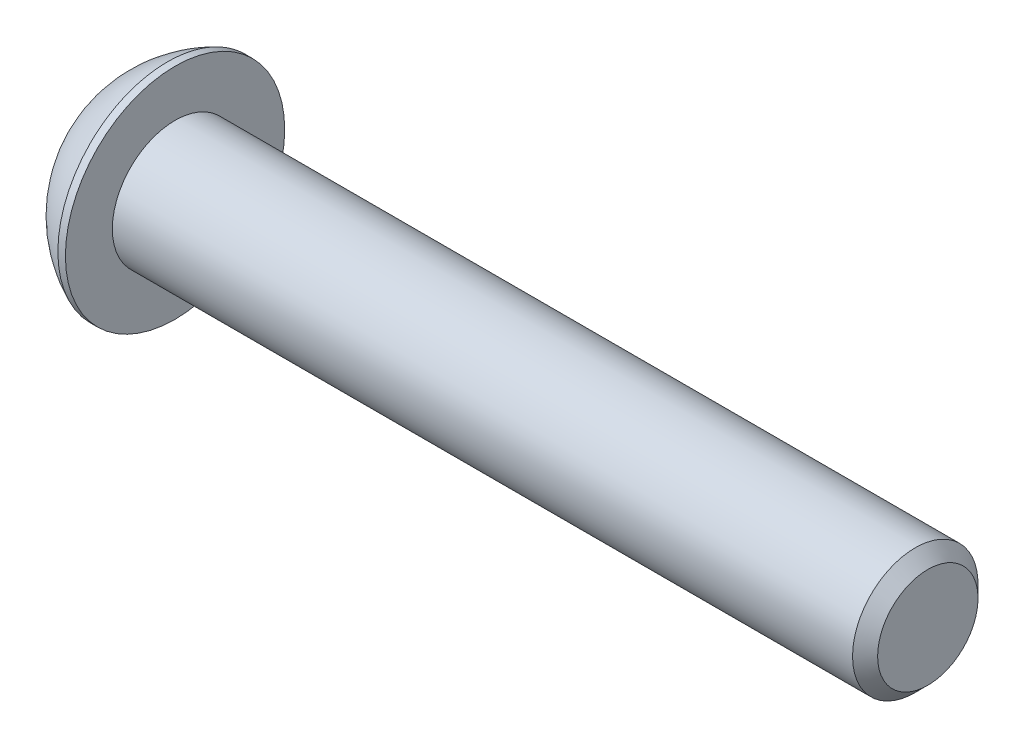
ISO-10303-21;
HEADER;
FILE_DESCRIPTION(('STEP AP214'),'2;1');
FILE_NAME('part.step','',(''),(''),'','','');
FILE_SCHEMA(('AUTOMOTIVE_DESIGN { 1 0 10303 214 1 1 1 1 }'));
ENDSEC;
DATA;
#1=APPLICATION_CONTEXT('core data for automotive mechanical design processes');
#2=APPLICATION_PROTOCOL_DEFINITION('international standard','automotive_design',2000,#1);
#3=PRODUCT_CONTEXT('',#1,'mechanical');
#4=PRODUCT('Part','Part','',(#3));
#5=PRODUCT_RELATED_PRODUCT_CATEGORY('part','',(#4));
#6=PRODUCT_DEFINITION_FORMATION('','',#4);
#7=PRODUCT_DEFINITION_CONTEXT('part definition',#1,'design');
#8=PRODUCT_DEFINITION('design','',#6,#7);
#9=PRODUCT_DEFINITION_SHAPE('','',#8);
#10=(LENGTH_UNIT() NAMED_UNIT(*) SI_UNIT(.MILLI.,.METRE.));
#11=(NAMED_UNIT(*) PLANE_ANGLE_UNIT() SI_UNIT($,.RADIAN.));
#12=(NAMED_UNIT(*) SI_UNIT($,.STERADIAN.) SOLID_ANGLE_UNIT());
#13=UNCERTAINTY_MEASURE_WITH_UNIT(LENGTH_MEASURE(1.E-05),#10,'distance_accuracy_value','');
#14=(GEOMETRIC_REPRESENTATION_CONTEXT(3) GLOBAL_UNCERTAINTY_ASSIGNED_CONTEXT((#13)) GLOBAL_UNIT_ASSIGNED_CONTEXT((#10,
#11,#12)) REPRESENTATION_CONTEXT('',''));
#15=CARTESIAN_POINT('',(0.,0.,0.));
#16=DIRECTION('',(0.,0.,1.));
#17=DIRECTION('',(1.,0.,0.));
#18=AXIS2_PLACEMENT_3D('',#15,#16,#17);
#19=CARTESIAN_POINT('',(1.32080000000034,0.,0.));
#20=DIRECTION('',(-1.,0.,0.));
#21=DIRECTION('',(0.,0.,1.));
#22=AXIS2_PLACEMENT_3D('',#19,#20,#21);
#23=CONICAL_SURFACE('',#22,1.1937999999998,1.04719755119608);
#24=CARTESIAN_POINT('',(2.01004075135902,0.,-4.44089209850063E-13));
#25=VERTEX_POINT('',#24);
#26=VERTEX_LOOP('',#25);
#27=FACE_BOUND('',#26,.T.);
#28=CARTESIAN_POINT('',(1.32080000000009,0.,0.));
#29=DIRECTION('',(-1.,0.,0.));
#30=DIRECTION('',(0.,0.,1.));
#31=AXIS2_PLACEMENT_3D('',#28,#29,#30);
#32=CIRCLE('',#31,1.19380000000024);
#33=CARTESIAN_POINT('',(1.32080000000009,0.,1.19380000000024));
#34=VERTEX_POINT('',#33);
#35=EDGE_CURVE('E20',#34,#34,#32,.T.);
#36=ORIENTED_EDGE('',*,*,#35,.T.);
#37=EDGE_LOOP('',(#36));
#38=FACE_BOUND('',#37,.T.);
#39=ADVANCED_FACE('F17',(#27,#38),#23,.F.);
#40=CARTESIAN_POINT('',(1.3208,-2.28769270663697,0.));
#41=DIRECTION('',(1.,0.,0.));
#42=DIRECTION('',(0.,0.,-1.));
#43=AXIS2_PLACEMENT_3D('',#40,#41,#42);
#44=PLANE('',#43);
#45=DIRECTION('',(0.,1.,0.));
#46=VECTOR('',#45,1.);
#47=CARTESIAN_POINT('',(1.3208,-1.14384635331849,1.9812));
#48=LINE('',#47,#46);
#49=CARTESIAN_POINT('',(1.3208,1.14384635331849,1.9812));
#50=VERTEX_POINT('',#49);
#51=CARTESIAN_POINT('',(1.3208,-1.14384635331849,1.9812));
#52=VERTEX_POINT('',#51);
#53=EDGE_CURVE('E69',#50,#52,#48,.F.);
#54=ORIENTED_EDGE('',*,*,#53,.F.);
#55=DIRECTION('',(0.,0.5,-0.866025403784439));
#56=VECTOR('',#55,1.);
#57=CARTESIAN_POINT('',(1.3208,1.14384635331849,1.9812));
#58=LINE('',#57,#56);
#59=CARTESIAN_POINT('',(1.3208,2.28769270663697,0.));
#60=VERTEX_POINT('',#59);
#61=EDGE_CURVE('E287',#60,#50,#58,.F.);
#62=ORIENTED_EDGE('',*,*,#61,.F.);
#63=DIRECTION('',(0.,-0.5,-0.866025403784439));
#64=VECTOR('',#63,1.);
#65=CARTESIAN_POINT('',(1.3208,2.28769270663697,0.));
#66=LINE('',#65,#64);
#67=CARTESIAN_POINT('',(1.3208,1.14384635331849,-1.9812));
#68=VERTEX_POINT('',#67);
#69=EDGE_CURVE('E291',#68,#60,#66,.F.);
#70=ORIENTED_EDGE('',*,*,#69,.F.);
#71=DIRECTION('',(0.,1.,0.));
#72=VECTOR('',#71,1.);
#73=CARTESIAN_POINT('',(1.3208,1.14384635331849,-1.9812));
#74=LINE('',#73,#72);
#75=CARTESIAN_POINT('',(1.3208,-1.14384635331849,-1.9812));
#76=VERTEX_POINT('',#75);
#77=EDGE_CURVE('E296',#76,#68,#74,.T.);
#78=ORIENTED_EDGE('',*,*,#77,.F.);
#79=DIRECTION('',(0.,-0.5,0.866025403784438));
#80=VECTOR('',#79,1.);
#81=CARTESIAN_POINT('',(1.3208,-1.14384635331849,-1.9812));
#82=LINE('',#81,#80);
#83=CARTESIAN_POINT('',(1.3208,-2.28769270663697,0.));
#84=VERTEX_POINT('',#83);
#85=EDGE_CURVE('E301',#84,#76,#82,.F.);
#86=ORIENTED_EDGE('',*,*,#85,.F.);
#87=DIRECTION('',(0.,0.500000000000001,0.866025403784438));
#88=VECTOR('',#87,1.);
#89=CARTESIAN_POINT('',(1.3208,-2.28769270663697,0.));
#90=LINE('',#89,#88);
#91=EDGE_CURVE('E82',#52,#84,#90,.F.);
#92=ORIENTED_EDGE('',*,*,#91,.F.);
#93=EDGE_LOOP('',(#54,#62,#70,#78,#86,#92));
#94=FACE_BOUND('',#93,.T.);
#95=ORIENTED_EDGE('',*,*,#35,.F.);
#96=EDGE_LOOP('',(#95));
#97=FACE_BOUND('',#96,.T.);
#98=ADVANCED_FACE('F75',(#94,#97),#44,.F.);
#99=CARTESIAN_POINT('',(1.3208,-1.14384635331849,1.9812));
#100=DIRECTION('',(0.,0.,-1.));
#101=DIRECTION('',(-1.,0.,0.));
#102=AXIS2_PLACEMENT_3D('',#99,#100,#101);
#103=PLANE('',#102);
#104=ORIENTED_EDGE('',*,*,#53,.T.);
#105=DIRECTION('',(1.,0.,0.));
#106=VECTOR('',#105,1.);
#107=CARTESIAN_POINT('',(1.3208,-1.14384635331849,1.9812));
#108=LINE('',#107,#106);
#109=CARTESIAN_POINT('',(0.,-1.14384635331849,1.9812));
#110=VERTEX_POINT('',#109);
#111=EDGE_CURVE('E79',#110,#52,#108,.T.);
#112=ORIENTED_EDGE('',*,*,#111,.F.);
#113=DIRECTION('',(0.,1.,0.));
#114=VECTOR('',#113,1.);
#115=CARTESIAN_POINT('',(0.,0.,1.9812));
#116=LINE('',#115,#114);
#117=CARTESIAN_POINT('',(0.,1.14384635331849,1.9812));
#118=VERTEX_POINT('',#117);
#119=EDGE_CURVE('E281',#118,#110,#116,.F.);
#120=ORIENTED_EDGE('',*,*,#119,.F.);
#121=DIRECTION('',(1.,0.,0.));
#122=VECTOR('',#121,1.);
#123=CARTESIAN_POINT('',(1.3208,1.14384635331849,1.9812));
#124=LINE('',#123,#122);
#125=EDGE_CURVE('E284',#50,#118,#124,.F.);
#126=ORIENTED_EDGE('',*,*,#125,.F.);
#127=EDGE_LOOP('',(#104,#112,#120,#126));
#128=FACE_BOUND('',#127,.T.);
#129=ADVANCED_FACE('F128',(#128),#103,.T.);
#130=CARTESIAN_POINT('',(1.3208,-2.28769270663697,0.));
#131=DIRECTION('',(0.,0.866025403784438,-0.500000000000001));
#132=DIRECTION('',(0.,0.500000000000001,0.866025403784438));
#133=AXIS2_PLACEMENT_3D('',#130,#131,#132);
#134=PLANE('',#133);
#135=ORIENTED_EDGE('',*,*,#91,.T.);
#136=DIRECTION('',(1.,0.,0.));
#137=VECTOR('',#136,1.);
#138=CARTESIAN_POINT('',(1.3208,-2.28769270663697,0.));
#139=LINE('',#138,#137);
#140=CARTESIAN_POINT('',(0.,-2.28769270663697,0.));
#141=VERTEX_POINT('',#140);
#142=EDGE_CURVE('E303',#141,#84,#139,.T.);
#143=ORIENTED_EDGE('',*,*,#142,.F.);
#144=DIRECTION('',(0.,-0.500000000000001,-0.866025403784438));
#145=VECTOR('',#144,1.);
#146=CARTESIAN_POINT('',(0.,-1.14384635331849,1.9812));
#147=LINE('',#146,#145);
#148=EDGE_CURVE('E278',#110,#141,#147,.T.);
#149=ORIENTED_EDGE('',*,*,#148,.F.);
#150=ORIENTED_EDGE('',*,*,#111,.T.);
#151=EDGE_LOOP('',(#135,#143,#149,#150));
#152=FACE_BOUND('',#151,.T.);
#153=ADVANCED_FACE('F124',(#152),#134,.T.);
#154=CARTESIAN_POINT('',(1.3208,-1.14384635331849,-1.9812));
#155=DIRECTION('',(0.,0.866025403784438,0.5));
#156=DIRECTION('',(0.,-0.5,0.866025403784438));
#157=AXIS2_PLACEMENT_3D('',#154,#155,#156);
#158=PLANE('',#157);
#159=ORIENTED_EDGE('',*,*,#85,.T.);
#160=DIRECTION('',(1.,0.,0.));
#161=VECTOR('',#160,1.);
#162=CARTESIAN_POINT('',(1.3208,-1.14384635331849,-1.9812));
#163=LINE('',#162,#161);
#164=CARTESIAN_POINT('',(0.,-1.14384635331849,-1.9812));
#165=VERTEX_POINT('',#164);
#166=EDGE_CURVE('E298',#165,#76,#163,.T.);
#167=ORIENTED_EDGE('',*,*,#166,.F.);
#168=DIRECTION('',(0.,0.5,-0.866025403784438));
#169=VECTOR('',#168,1.);
#170=CARTESIAN_POINT('',(0.,-2.28769270663697,0.));
#171=LINE('',#170,#169);
#172=EDGE_CURVE('E275',#141,#165,#171,.T.);
#173=ORIENTED_EDGE('',*,*,#172,.F.);
#174=ORIENTED_EDGE('',*,*,#142,.T.);
#175=EDGE_LOOP('',(#159,#167,#173,#174));
#176=FACE_BOUND('',#175,.T.);
#177=ADVANCED_FACE('F120',(#176),#158,.T.);
#178=CARTESIAN_POINT('',(1.3208,1.14384635331849,-1.9812));
#179=DIRECTION('',(0.,0.,1.));
#180=DIRECTION('',(1.,0.,0.));
#181=AXIS2_PLACEMENT_3D('',#178,#179,#180);
#182=PLANE('',#181);
#183=ORIENTED_EDGE('',*,*,#77,.T.);
#184=DIRECTION('',(1.,0.,0.));
#185=VECTOR('',#184,1.);
#186=CARTESIAN_POINT('',(1.3208,1.14384635331849,-1.9812));
#187=LINE('',#186,#185);
#188=CARTESIAN_POINT('',(0.,1.14384635331849,-1.9812));
#189=VERTEX_POINT('',#188);
#190=EDGE_CURVE('E293',#189,#68,#187,.T.);
#191=ORIENTED_EDGE('',*,*,#190,.F.);
#192=DIRECTION('',(0.,1.,0.));
#193=VECTOR('',#192,1.);
#194=CARTESIAN_POINT('',(0.,0.,-1.9812));
#195=LINE('',#194,#193);
#196=EDGE_CURVE('E272',#165,#189,#195,.T.);
#197=ORIENTED_EDGE('',*,*,#196,.F.);
#198=ORIENTED_EDGE('',*,*,#166,.T.);
#199=EDGE_LOOP('',(#183,#191,#197,#198));
#200=FACE_BOUND('',#199,.T.);
#201=ADVANCED_FACE('F117',(#200),#182,.T.);
#202=CARTESIAN_POINT('',(1.3208,2.28769270663697,0.));
#203=DIRECTION('',(0.,-0.866025403784439,0.5));
#204=DIRECTION('',(0.,-0.5,-0.866025403784439));
#205=AXIS2_PLACEMENT_3D('',#202,#203,#204);
#206=PLANE('',#205);
#207=ORIENTED_EDGE('',*,*,#69,.T.);
#208=DIRECTION('',(1.,0.,0.));
#209=VECTOR('',#208,1.);
#210=CARTESIAN_POINT('',(1.3208,2.28769270663697,0.));
#211=LINE('',#210,#209);
#212=CARTESIAN_POINT('',(0.,2.28769270663697,0.));
#213=VERTEX_POINT('',#212);
#214=EDGE_CURVE('E35',#213,#60,#211,.T.);
#215=ORIENTED_EDGE('',*,*,#214,.F.);
#216=DIRECTION('',(0.,0.5,0.866025403784439));
#217=VECTOR('',#216,1.);
#218=CARTESIAN_POINT('',(0.,1.14384635331849,-1.9812));
#219=LINE('',#218,#217);
#220=EDGE_CURVE('E269',#189,#213,#219,.T.);
#221=ORIENTED_EDGE('',*,*,#220,.F.);
#222=ORIENTED_EDGE('',*,*,#190,.T.);
#223=EDGE_LOOP('',(#207,#215,#221,#222));
#224=FACE_BOUND('',#223,.T.);
#225=ADVANCED_FACE('F113',(#224),#206,.T.);
#226=CARTESIAN_POINT('',(1.3208,1.14384635331849,1.9812));
#227=DIRECTION('',(0.,-0.866025403784439,-0.5));
#228=DIRECTION('',(0.,0.5,-0.866025403784439));
#229=AXIS2_PLACEMENT_3D('',#226,#227,#228);
#230=PLANE('',#229);
#231=ORIENTED_EDGE('',*,*,#61,.T.);
#232=ORIENTED_EDGE('',*,*,#125,.T.);
#233=DIRECTION('',(0.,-0.5,0.866025403784439));
#234=VECTOR('',#233,1.);
#235=CARTESIAN_POINT('',(0.,2.28769270663697,0.));
#236=LINE('',#235,#234);
#237=EDGE_CURVE('E100',#213,#118,#236,.T.);
#238=ORIENTED_EDGE('',*,*,#237,.F.);
#239=ORIENTED_EDGE('',*,*,#214,.T.);
#240=EDGE_LOOP('',(#231,#232,#238,#239));
#241=FACE_BOUND('',#240,.T.);
#242=ADVANCED_FACE('F109',(#241),#230,.T.);
#243=CARTESIAN_POINT('',(0.,0.,0.));
#244=DIRECTION('',(-1.,0.,0.));
#245=DIRECTION('',(0.,0.,1.));
#246=AXIS2_PLACEMENT_3D('',#243,#244,#245);
#247=PLANE('',#246);
#248=ORIENTED_EDGE('',*,*,#220,.T.);
#249=ORIENTED_EDGE('',*,*,#237,.T.);
#250=ORIENTED_EDGE('',*,*,#119,.T.);
#251=ORIENTED_EDGE('',*,*,#148,.T.);
#252=ORIENTED_EDGE('',*,*,#172,.T.);
#253=ORIENTED_EDGE('',*,*,#196,.T.);
#254=EDGE_LOOP('',(#248,#249,#250,#251,#252,#253));
#255=FACE_BOUND('',#254,.T.);
#256=CARTESIAN_POINT('',(0.,2.77495,0.));
#257=CARTESIAN_POINT('',(0.,2.77494953309947,0.0779118937523458));
#258=CARTESIAN_POINT('',(0.,2.77166578388025,0.15583810591977));
#259=CARTESIAN_POINT('',(0.,2.75855213600204,0.311152012455904));
#260=CARTESIAN_POINT('',(0.,2.74872030471467,0.388539541019556));
#261=CARTESIAN_POINT('',(0.,2.72255472645676,0.542341518735717));
#262=CARTESIAN_POINT('',(-2.70414110576258E-13,2.70621065843662,0.618754223567578));
#263=CARTESIAN_POINT('',(2.71501725221868E-13,2.66713326915777,0.769973634286023));
#264=CARTESIAN_POINT('',(1.01274952524446E-12,2.64439476297869,0.844778983646282));
#265=CARTESIAN_POINT('',(1.81909959813207E-12,2.5669019594335,1.06566239301792));
#266=CARTESIAN_POINT('',(4.77081687541822E-13,2.50280672569928,1.20857954243987));
#267=CARTESIAN_POINT('',(-4.76232447128611E-13,2.35149826934097,1.48160874561538));
#268=CARTESIAN_POINT('',(0.,2.26428416790396,1.61172031233499));
#269=CARTESIAN_POINT('',(0.,2.1181093928834,1.79445660654268));
#270=CARTESIAN_POINT('',(0.,2.06678693791626,1.85333128513997));
#271=CARTESIAN_POINT('',(0.,1.95940522984449,1.96650727912792));
#272=CARTESIAN_POINT('',(0.,1.90335059143535,2.02081294920044));
#273=CARTESIAN_POINT('',(0.,1.78683891013963,2.12453280878582));
#274=CARTESIAN_POINT('',(0.,1.72637988450322,2.1739447713554));
#275=CARTESIAN_POINT('',(0.,1.60151968865711,2.26750481692908));
#276=CARTESIAN_POINT('',(0.,1.53711760864537,2.31165167810847));
#277=CARTESIAN_POINT('',(0.,1.33869902291632,2.43567242603944));
#278=CARTESIAN_POINT('',(0.,1.19934704110695,2.507235886628));
#279=CARTESIAN_POINT('',(0.,0.91068160912188,2.62590828672821));
#280=CARTESIAN_POINT('',(0.,0.761368265357397,2.67301748742278));
#281=CARTESIAN_POINT('',(0.,0.456932649466622,2.74151230664007));
#282=CARTESIAN_POINT('',(0.,0.301810346322583,2.76289778778721));
#283=CARTESIAN_POINT('',(0.,-0.0098226387089525,2.77931595661156));
#284=CARTESIAN_POINT('',(0.,-0.166333320596449,2.77434864428877));
#285=CARTESIAN_POINT('',(0.,-0.476280836814453,2.73822217653073));
#286=CARTESIAN_POINT('',(0.,-0.629717687555987,2.70706316096981));
#287=CARTESIAN_POINT('',(0.,-0.929254830044276,2.61937980771149));
#288=CARTESIAN_POINT('',(0.,-1.0753550434132,2.56285519909568));
#289=CARTESIAN_POINT('',(0.,-1.28570692598579,2.46037024128109));
#290=CARTESIAN_POINT('',(0.,-1.35439130022287,2.42323494812896));
#291=CARTESIAN_POINT('',(0.,-1.488391287199,2.34331277270256));
#292=CARTESIAN_POINT('',(0.,-1.55370767631787,2.30052720108831));
#293=CARTESIAN_POINT('',(0.,-1.68047292776594,2.20962421887055));
#294=CARTESIAN_POINT('',(0.,-1.7419235278682,2.16150923122348));
#295=CARTESIAN_POINT('',(0.,-1.86060297067992,2.06024311301283));
#296=CARTESIAN_POINT('',(0.,-1.91782768181715,2.0070871669763));
#297=CARTESIAN_POINT('',(0.,-2.08239462196651,1.8407220856554));
#298=CARTESIAN_POINT('',(0.,-2.18279764272601,1.72049499758422));
#299=CARTESIAN_POINT('',(0.,-2.36195754944064,1.46487629213018));
#300=CARTESIAN_POINT('',(0.,-2.44071525816758,1.32948525142807));
#301=CARTESIAN_POINT('',(0.,-2.54098882695274,1.11796734074395));
#302=CARTESIAN_POINT('',(0.,-2.57146177392727,1.04596540008347));
#303=CARTESIAN_POINT('',(0.,-2.62621251108999,0.899689259475765));
#304=CARTESIAN_POINT('',(0.,-2.65049531495563,0.825416953360953));
#305=CARTESIAN_POINT('',(0.,-2.69267708798766,0.675215808695207));
#306=CARTESIAN_POINT('',(0.,-2.71058613777937,0.599289789313091));
#307=CARTESIAN_POINT('',(0.,-2.73994710360127,0.446213628496931));
#308=CARTESIAN_POINT('',(0.,-2.75140092413871,0.369063855024788));
#309=CARTESIAN_POINT('',(0.,-2.76470470685522,0.24316208817343));
#310=CARTESIAN_POINT('',(0.,-2.76854547596618,0.194611672428576));
#311=CARTESIAN_POINT('',(0.,-2.77366826843264,0.0973760351839811));
#312=CARTESIAN_POINT('',(0.,-2.77495029178814,0.0486908136842395));
#313=CARTESIAN_POINT('',(0.,-2.77494953309947,-0.0779118937523474));
#314=CARTESIAN_POINT('',(0.,-2.77166578388025,-0.155838105919772));
#315=CARTESIAN_POINT('',(0.,-2.75855213600204,-0.311152012455906));
#316=CARTESIAN_POINT('',(0.,-2.74872030471467,-0.388539541019558));
#317=CARTESIAN_POINT('',(0.,-2.72255472645677,-0.542341518735719));
#318=CARTESIAN_POINT('',(-2.70149297926331E-13,-2.70621065843663,-0.61875422356758));
#319=CARTESIAN_POINT('',(2.712366972268E-13,-2.66713326915777,-0.769973634286025));
#320=CARTESIAN_POINT('',(1.01141467738461E-12,-2.64439476297869,-0.844778983646283));
#321=CARTESIAN_POINT('',(1.81656702958366E-12,-2.5669019594335,-1.06566239301792));
#322=CARTESIAN_POINT('',(4.7641829195856E-13,-2.50280672569928,-1.20857954243988));
#323=CARTESIAN_POINT('',(-4.75569026324207E-13,-2.35149826934097,-1.48160874561538));
#324=CARTESIAN_POINT('',(0.,-2.26428416790396,-1.61172031233499));
#325=CARTESIAN_POINT('',(0.,-2.1181093928834,-1.79445660654268));
#326=CARTESIAN_POINT('',(0.,-2.06678693791626,-1.85333128513996));
#327=CARTESIAN_POINT('',(0.,-1.95940522984449,-1.96650727912792));
#328=CARTESIAN_POINT('',(0.,-1.90335059143535,-2.02081294920045));
#329=CARTESIAN_POINT('',(0.,-1.78683891013963,-2.12453280878582));
#330=CARTESIAN_POINT('',(0.,-1.72637988450322,-2.1739447713554));
#331=CARTESIAN_POINT('',(0.,-1.60151968865711,-2.26750481692908));
#332=CARTESIAN_POINT('',(0.,-1.53711760864537,-2.31165167810847));
#333=CARTESIAN_POINT('',(0.,-1.33869902291632,-2.43567242603944));
#334=CARTESIAN_POINT('',(0.,-1.19934704110695,-2.507235886628));
#335=CARTESIAN_POINT('',(0.,-0.91068160912188,-2.62590828672821));
#336=CARTESIAN_POINT('',(0.,-0.761368265357397,-2.67301748742278));
#337=CARTESIAN_POINT('',(0.,-0.456932649466622,-2.74151230664007));
#338=CARTESIAN_POINT('',(0.,-0.301810346322583,-2.76289778778721));
#339=CARTESIAN_POINT('',(0.,0.00982263870895269,-2.77931595661156));
#340=CARTESIAN_POINT('',(0.,0.166333320596449,-2.77434864428876));
#341=CARTESIAN_POINT('',(0.,0.476280836814453,-2.73822217653073));
#342=CARTESIAN_POINT('',(0.,0.629717687555987,-2.70706316096981));
#343=CARTESIAN_POINT('',(0.,0.929254830044275,-2.6193798077115));
#344=CARTESIAN_POINT('',(0.,1.0753550434132,-2.56285519909568));
#345=CARTESIAN_POINT('',(0.,1.28570692598579,-2.46037024128109));
#346=CARTESIAN_POINT('',(0.,1.35439130022286,-2.42323494812896));
#347=CARTESIAN_POINT('',(0.,1.488391287199,-2.34331277270256));
#348=CARTESIAN_POINT('',(0.,1.55370767631787,-2.30052720108831));
#349=CARTESIAN_POINT('',(0.,1.68047292776594,-2.20962421887055));
#350=CARTESIAN_POINT('',(0.,1.7419235278682,-2.16150923122348));
#351=CARTESIAN_POINT('',(0.,1.86060297067992,-2.06024311301283));
#352=CARTESIAN_POINT('',(0.,1.91782768181715,-2.0070871669763));
#353=CARTESIAN_POINT('',(0.,2.08239462196651,-1.8407220856554));
#354=CARTESIAN_POINT('',(0.,2.18279764272601,-1.72049499758422));
#355=CARTESIAN_POINT('',(0.,2.36195754944063,-1.46487629213018));
#356=CARTESIAN_POINT('',(0.,2.44071525816757,-1.32948525142807));
#357=CARTESIAN_POINT('',(0.,2.54098882695274,-1.11796734074395));
#358=CARTESIAN_POINT('',(0.,2.57146177392727,-1.04596540008347));
#359=CARTESIAN_POINT('',(0.,2.62621251108999,-0.899689259475766));
#360=CARTESIAN_POINT('',(0.,2.65049531495563,-0.825416953360953));
#361=CARTESIAN_POINT('',(0.,2.69267708798766,-0.675215808695207));
#362=CARTESIAN_POINT('',(0.,2.71058613777936,-0.599289789313091));
#363=CARTESIAN_POINT('',(0.,2.73994710360127,-0.446213628496932));
#364=CARTESIAN_POINT('',(0.,2.75140092413871,-0.369063855024789));
#365=CARTESIAN_POINT('',(0.,2.76470470685522,-0.243162088173432));
#366=CARTESIAN_POINT('',(0.,2.76854547596618,-0.194611672428578));
#367=CARTESIAN_POINT('',(0.,2.77366826843264,-0.0973760351839823));
#368=CARTESIAN_POINT('',(0.,2.77495029178814,-0.0486908136842408));
#369=CARTESIAN_POINT('',(0.,2.77495,0.));
#370=B_SPLINE_CURVE_WITH_KNOTS('',3,(#256,#257,#258,#259,#260,#261,#262,#263,#264,#265,#266,
#267,#268,#269,#270,#271,#272,#273,#274,#275,#276,#277,#278,#279,#280,#281,#282,#283,#284,#285,
#286,#287,#288,#289,#290,#291,#292,#293,#294,#295,#296,#297,#298,#299,#300,#301,#302,#303,#304,
#305,#306,#307,#308,#309,#310,#311,#312,#313,#314,#315,#316,#317,#318,#319,#320,#321,#322,#323,
#324,#325,#326,#327,#328,#329,#330,#331,#332,#333,#334,#335,#336,#337,#338,#339,#340,#341,#342,
#343,#344,#345,#346,#347,#348,#349,#350,#351,#352,#353,#354,#355,#356,#357,#358,#359,#360,#361,
#362,#363,#364,#365,#366,#367,#368,#369),.UNSPECIFIED.,.T.,.F.,(4,2,2,2,2,2,2,2,2,2,2,2,2,2,2,2,
2,2,2,2,2,2,2,2,2,2,2,2,2,2,2,2,2,2,2,2,2,2,2,2,2,2,2,2,2,2,2,2,2,2,2,2,2,2,2,2,4),(0.,
0.233690856748162,0.467450716578751,0.701582538521471,0.935904756015414,1.40343220467667,
1.87097742791502,2.10505636898837,2.33890962270652,2.57286880998746,2.80688218486306,
3.27442101763127,3.74195485676357,4.20949119271389,4.67702752866417,5.14456136779641,
5.61210020056468,5.84611357544033,6.08007276272136,6.31392601643949,6.54800495751272,
7.01555018075071,7.48307762941212,7.71739984690652,7.95153166884955,8.18529152868022,
8.41898238542855,8.56502681353347,8.71107124163843,8.94476209838659,9.17852195821718,
9.4126537801599,9.64697599765384,10.1145034463151,10.5820486695534,10.8161276106268,
11.0499808643449,11.2839400516259,11.5179534265015,11.9854922592697,12.453026098402,
12.9205624343523,13.3880987703026,13.8556326094348,14.3231714422031,14.5571848170788,
14.7911440043598,15.0249972580779,15.2590761991512,15.7266214223891,16.1941488710506,
16.4284710885449,16.662602910488,16.8963627703186,17.130053627067,17.2760980551719,
17.4221424832769),.UNSPECIFIED.);
#371=CARTESIAN_POINT('',(0.,2.77495,0.));
#372=VERTEX_POINT('',#371);
#373=EDGE_CURVE('E94',#372,#372,#370,.T.);
#374=ORIENTED_EDGE('',*,*,#373,.F.);
#375=EDGE_LOOP('',(#374));
#376=FACE_BOUND('',#375,.T.);
#377=ADVANCED_FACE('F105',(#255,#376),#247,.T.);
#378=CARTESIAN_POINT('',(5.37260881410256,0.,0.));
#379=DIRECTION('',(0.,1.,0.));
#380=DIRECTION('',(1.,0.,0.));
#381=AXIS2_PLACEMENT_3D('',#378,#379,#380);
#382=SPHERICAL_SURFACE('',#381,6.04692260342999);
#383=CARTESIAN_POINT('',(2.9718,0.,0.));
#384=DIRECTION('',(-1.,0.,0.));
#385=DIRECTION('',(0.,0.,1.));
#386=AXIS2_PLACEMENT_3D('',#383,#384,#385);
#387=CIRCLE('',#386,5.5499);
#388=CARTESIAN_POINT('',(2.9718,0.,5.5499));
#389=VERTEX_POINT('',#388);
#390=EDGE_CURVE('E92',#389,#389,#387,.F.);
#391=ORIENTED_EDGE('',*,*,#390,.F.);
#392=EDGE_LOOP('',(#391));
#393=FACE_BOUND('',#392,.T.);
#394=ORIENTED_EDGE('',*,*,#373,.T.);
#395=EDGE_LOOP('',(#394));
#396=FACE_BOUND('',#395,.T.);
#397=ADVANCED_FACE('F101',(#393,#396),#382,.T.);
#398=CARTESIAN_POINT('',(41.4528,0.,0.));
#399=DIRECTION('',(-1.,0.,0.));
#400=DIRECTION('',(0.,0.,1.));
#401=AXIS2_PLACEMENT_3D('',#398,#399,#400);
#402=PLANE('',#401);
#403=CARTESIAN_POINT('',(41.4528000000018,0.,0.));
#404=DIRECTION('',(-1.,0.,0.));
#405=DIRECTION('',(0.,0.,1.));
#406=AXIS2_PLACEMENT_3D('',#403,#404,#405);
#407=CIRCLE('',#406,2.54000000001042);
#408=CARTESIAN_POINT('',(41.4528000000018,0.,2.54000000001042));
#409=VERTEX_POINT('',#408);
#410=EDGE_CURVE('E89',#409,#409,#407,.T.);
#411=ORIENTED_EDGE('',*,*,#410,.F.);
#412=EDGE_LOOP('',(#411));
#413=FACE_BOUND('',#412,.T.);
#414=ADVANCED_FACE('F154',(#413),#402,.F.);
#415=CARTESIAN_POINT('',(0.,0.,0.));
#416=DIRECTION('',(-1.,0.,0.));
#417=DIRECTION('',(0.,0.,1.));
#418=AXIS2_PLACEMENT_3D('',#415,#416,#417);
#419=CYLINDRICAL_SURFACE('',#418,5.5499);
#420=ORIENTED_EDGE('',*,*,#390,.T.);
#421=EDGE_LOOP('',(#420));
#422=FACE_BOUND('',#421,.T.);
#423=CARTESIAN_POINT('',(3.3528,0.,0.));
#424=DIRECTION('',(-1.,0.,0.));
#425=DIRECTION('',(0.,0.,1.));
#426=AXIS2_PLACEMENT_3D('',#423,#424,#425);
#427=CIRCLE('',#426,5.5499);
#428=CARTESIAN_POINT('',(3.3528,0.,5.5499));
#429=VERTEX_POINT('',#428);
#430=EDGE_CURVE('E86',#429,#429,#427,.T.);
#431=ORIENTED_EDGE('',*,*,#430,.T.);
#432=EDGE_LOOP('',(#431));
#433=FACE_BOUND('',#432,.T.);
#434=ADVANCED_FACE('F151',(#422,#433),#419,.T.);
#435=CARTESIAN_POINT('',(40.8178000000703,0.,0.));
#436=DIRECTION('',(-1.,0.,0.));
#437=DIRECTION('',(0.,0.,1.));
#438=AXIS2_PLACEMENT_3D('',#435,#436,#437);
#439=CONICAL_SURFACE('',#438,3.17499999999882,0.785398163442207);
#440=CARTESIAN_POINT('',(40.8178,0.,0.));
#441=DIRECTION('',(-1.,0.,0.));
#442=DIRECTION('',(0.,0.,1.));
#443=AXIS2_PLACEMENT_3D('',#440,#441,#442);
#444=CIRCLE('',#443,3.175);
#445=CARTESIAN_POINT('',(40.8178,0.,3.175));
#446=VERTEX_POINT('',#445);
#447=EDGE_CURVE('E26',#446,#446,#444,.T.);
#448=ORIENTED_EDGE('',*,*,#447,.F.);
#449=EDGE_LOOP('',(#448));
#450=FACE_BOUND('',#449,.T.);
#451=ORIENTED_EDGE('',*,*,#410,.T.);
#452=EDGE_LOOP('',(#451));
#453=FACE_BOUND('',#452,.T.);
#454=ADVANCED_FACE('F144',(#450,#453),#439,.T.);
#455=CARTESIAN_POINT('',(3.3528,3.175,0.));
#456=DIRECTION('',(-1.,0.,0.));
#457=DIRECTION('',(0.,0.,1.));
#458=AXIS2_PLACEMENT_3D('',#455,#456,#457);
#459=PLANE('',#458);
#460=CARTESIAN_POINT('',(3.3528,0.,0.));
#461=DIRECTION('',(-1.,0.,0.));
#462=DIRECTION('',(0.,0.,1.));
#463=AXIS2_PLACEMENT_3D('',#460,#461,#462);
#464=CIRCLE('',#463,3.175);
#465=CARTESIAN_POINT('',(3.3528,0.,3.175));
#466=VERTEX_POINT('',#465);
#467=EDGE_CURVE('E11',#466,#466,#464,.F.);
#468=ORIENTED_EDGE('',*,*,#467,.F.);
#469=EDGE_LOOP('',(#468));
#470=FACE_BOUND('',#469,.T.);
#471=ORIENTED_EDGE('',*,*,#430,.F.);
#472=EDGE_LOOP('',(#471));
#473=FACE_BOUND('',#472,.T.);
#474=ADVANCED_FACE('F138',(#470,#473),#459,.F.);
#475=CARTESIAN_POINT('',(0.,0.,0.));
#476=DIRECTION('',(-1.,0.,0.));
#477=DIRECTION('',(0.,0.,1.));
#478=AXIS2_PLACEMENT_3D('',#475,#476,#477);
#479=CYLINDRICAL_SURFACE('',#478,3.175);
#480=ORIENTED_EDGE('',*,*,#467,.T.);
#481=EDGE_LOOP('',(#480));
#482=FACE_BOUND('',#481,.T.);
#483=ORIENTED_EDGE('',*,*,#447,.T.);
#484=EDGE_LOOP('',(#483));
#485=FACE_BOUND('',#484,.T.);
#486=ADVANCED_FACE('F136',(#482,#485),#479,.T.);
#487=CLOSED_SHELL('',(#39,#98,#129,#153,#177,#201,#225,#242,#377,#397,#414,#434,#454,#474,#486));
#488=MANIFOLD_SOLID_BREP('B1',#487);
#489=ADVANCED_BREP_SHAPE_REPRESENTATION('',(#18,#488),#14);
#490=SHAPE_DEFINITION_REPRESENTATION(#9,#489);
ENDSEC;
END-ISO-10303-21;
